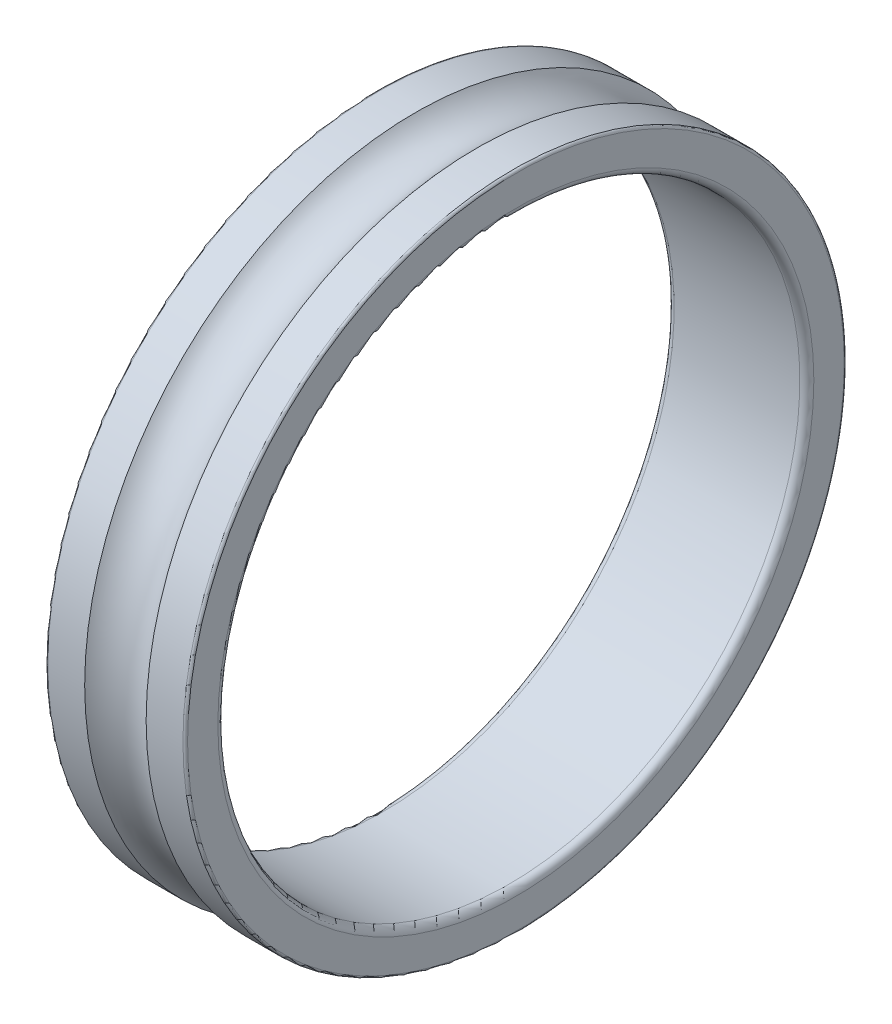
ISO-10303-21;
HEADER;
FILE_DESCRIPTION(('STEP AP214'),'2;1');
FILE_NAME('part.step','',(''),(''),'','','');
FILE_SCHEMA(('AUTOMOTIVE_DESIGN { 1 0 10303 214 1 1 1 1 }'));
ENDSEC;
DATA;
#1=APPLICATION_CONTEXT('core data for automotive mechanical design processes');
#2=APPLICATION_PROTOCOL_DEFINITION('international standard','automotive_design',2000,#1);
#3=PRODUCT_CONTEXT('',#1,'mechanical');
#4=PRODUCT('Part','Part','',(#3));
#5=PRODUCT_RELATED_PRODUCT_CATEGORY('part','',(#4));
#6=PRODUCT_DEFINITION_FORMATION('','',#4);
#7=PRODUCT_DEFINITION_CONTEXT('part definition',#1,'design');
#8=PRODUCT_DEFINITION('design','',#6,#7);
#9=PRODUCT_DEFINITION_SHAPE('','',#8);
#10=(LENGTH_UNIT() NAMED_UNIT(*) SI_UNIT(.MILLI.,.METRE.));
#11=(NAMED_UNIT(*) PLANE_ANGLE_UNIT() SI_UNIT($,.RADIAN.));
#12=(NAMED_UNIT(*) SI_UNIT($,.STERADIAN.) SOLID_ANGLE_UNIT());
#13=UNCERTAINTY_MEASURE_WITH_UNIT(LENGTH_MEASURE(1.E-05),#10,'distance_accuracy_value','');
#14=(GEOMETRIC_REPRESENTATION_CONTEXT(3) GLOBAL_UNCERTAINTY_ASSIGNED_CONTEXT((#13)) GLOBAL_UNIT_ASSIGNED_CONTEXT((#10,
#11,#12)) REPRESENTATION_CONTEXT('',''));
#15=CARTESIAN_POINT('',(0.,0.,0.));
#16=DIRECTION('',(0.,0.,1.));
#17=DIRECTION('',(1.,0.,0.));
#18=AXIS2_PLACEMENT_3D('',#15,#16,#17);
#19=CARTESIAN_POINT('',(0.,-28.72385287695,-28.2));
#20=DIRECTION('',(-1.,0.,0.));
#21=DIRECTION('',(0.,0.,1.));
#22=AXIS2_PLACEMENT_3D('',#19,#20,#21);
#23=PLANE('',#22);
#24=CARTESIAN_POINT('',(0.,0.,0.));
#25=DIRECTION('',(-1.,0.,0.));
#26=DIRECTION('',(0.,0.,-1.));
#27=AXIS2_PLACEMENT_3D('',#24,#25,#26);
#28=CIRCLE('',#27,28.1999999999995);
#29=CARTESIAN_POINT('',(0.,0.,-28.1999999999995));
#30=VERTEX_POINT('',#29);
#31=EDGE_CURVE('E50',#30,#30,#28,.F.);
#32=ORIENTED_EDGE('',*,*,#31,.F.);
#33=EDGE_LOOP('',(#32));
#34=FACE_BOUND('',#33,.T.);
#35=CARTESIAN_POINT('',(0.,0.,0.));
#36=DIRECTION('',(1.,0.,0.));
#37=DIRECTION('',(0.,0.,1.));
#38=AXIS2_PLACEMENT_3D('',#35,#36,#37);
#39=CIRCLE('',#38,25.6);
#40=CARTESIAN_POINT('',(0.,0.,25.6));
#41=VERTEX_POINT('',#40);
#42=EDGE_CURVE('E47',#41,#41,#39,.T.);
#43=ORIENTED_EDGE('',*,*,#42,.T.);
#44=EDGE_LOOP('',(#43));
#45=FACE_BOUND('',#44,.T.);
#46=ADVANCED_FACE('F15',(#34,#45),#23,.T.);
#47=CARTESIAN_POINT('',(12.,-28.7238528444883,28.2));
#48=DIRECTION('',(1.,0.,0.));
#49=DIRECTION('',(0.,0.,-1.));
#50=AXIS2_PLACEMENT_3D('',#47,#48,#49);
#51=PLANE('',#50);
#52=CARTESIAN_POINT('',(12.,0.,0.));
#53=DIRECTION('',(1.,0.,0.));
#54=DIRECTION('',(0.,-1.16841672664942E-09,1.));
#55=AXIS2_PLACEMENT_3D('',#52,#53,#54);
#56=CIRCLE('',#55,28.2);
#57=CARTESIAN_POINT('',(12.,-3.29493516915136E-08,28.2));
#58=VERTEX_POINT('',#57);
#59=EDGE_CURVE('E44',#58,#58,#56,.T.);
#60=ORIENTED_EDGE('',*,*,#59,.T.);
#61=EDGE_LOOP('',(#60));
#62=FACE_BOUND('',#61,.T.);
#63=CARTESIAN_POINT('',(12.,0.,0.));
#64=DIRECTION('',(-1.,0.,0.));
#65=DIRECTION('',(0.,0.,-1.));
#66=AXIS2_PLACEMENT_3D('',#63,#64,#65);
#67=CIRCLE('',#66,25.6);
#68=CARTESIAN_POINT('',(12.,0.,-25.6));
#69=VERTEX_POINT('',#68);
#70=EDGE_CURVE('E41',#69,#69,#67,.F.);
#71=ORIENTED_EDGE('',*,*,#70,.F.);
#72=EDGE_LOOP('',(#71));
#73=FACE_BOUND('',#72,.T.);
#74=ADVANCED_FACE('F58',(#62,#73),#51,.T.);
#75=CARTESIAN_POINT('',(0.599999999999872,0.,0.));
#76=DIRECTION('',(1.,0.,0.));
#77=DIRECTION('',(0.,0.,1.));
#78=AXIS2_PLACEMENT_3D('',#75,#76,#77);
#79=TOROIDAL_SURFACE('',#78,25.6,0.599999999999872);
#80=CARTESIAN_POINT('',(0.6,0.,0.));
#81=DIRECTION('',(1.,0.,0.));
#82=DIRECTION('',(0.,0.,1.));
#83=AXIS2_PLACEMENT_3D('',#80,#81,#82);
#84=CIRCLE('',#83,25.0000000000001);
#85=CARTESIAN_POINT('',(0.6,0.,25.0000000000001));
#86=VERTEX_POINT('',#85);
#87=EDGE_CURVE('E38',#86,#86,#84,.T.);
#88=ORIENTED_EDGE('',*,*,#87,.T.);
#89=EDGE_LOOP('',(#88));
#90=FACE_BOUND('',#89,.T.);
#91=ORIENTED_EDGE('',*,*,#42,.F.);
#92=EDGE_LOOP('',(#91));
#93=FACE_BOUND('',#92,.T.);
#94=ADVANCED_FACE('F62',(#90,#93),#79,.T.);
#95=CARTESIAN_POINT('',(100.,0.,0.));
#96=DIRECTION('',(1.,0.,0.));
#97=DIRECTION('',(0.,0.,1.));
#98=AXIS2_PLACEMENT_3D('',#95,#96,#97);
#99=CYLINDRICAL_SURFACE('',#98,25.);
#100=CARTESIAN_POINT('',(11.4,0.,0.));
#101=DIRECTION('',(1.,0.,0.));
#102=DIRECTION('',(0.,0.,1.));
#103=AXIS2_PLACEMENT_3D('',#100,#101,#102);
#104=CIRCLE('',#103,25.);
#105=CARTESIAN_POINT('',(11.4,0.,25.));
#106=VERTEX_POINT('',#105);
#107=EDGE_CURVE('E35',#106,#106,#104,.T.);
#108=ORIENTED_EDGE('',*,*,#107,.T.);
#109=EDGE_LOOP('',(#108));
#110=FACE_BOUND('',#109,.T.);
#111=ORIENTED_EDGE('',*,*,#87,.F.);
#112=EDGE_LOOP('',(#111));
#113=FACE_BOUND('',#112,.T.);
#114=ADVANCED_FACE('F64',(#110,#113),#99,.F.);
#115=CARTESIAN_POINT('',(11.4000000000002,0.,0.));
#116=DIRECTION('',(1.,0.,0.));
#117=DIRECTION('',(0.,0.,1.));
#118=AXIS2_PLACEMENT_3D('',#115,#116,#117);
#119=TOROIDAL_SURFACE('',#118,25.6,0.599999999999747);
#120=ORIENTED_EDGE('',*,*,#70,.T.);
#121=EDGE_LOOP('',(#120));
#122=FACE_BOUND('',#121,.T.);
#123=ORIENTED_EDGE('',*,*,#107,.F.);
#124=EDGE_LOOP('',(#123));
#125=FACE_BOUND('',#124,.T.);
#126=ADVANCED_FACE('F72',(#122,#125),#119,.T.);
#127=CARTESIAN_POINT('',(11.7999999999989,0.,0.));
#128=DIRECTION('',(1.,0.,0.));
#129=DIRECTION('',(0.,0.,1.));
#130=AXIS2_PLACEMENT_3D('',#127,#128,#129);
#131=TOROIDAL_SURFACE('',#130,28.199999999999,0.200000000001052);
#132=CARTESIAN_POINT('',(11.7999999999989,0.,0.));
#133=DIRECTION('',(1.,0.,0.));
#134=DIRECTION('',(0.,0.,1.));
#135=AXIS2_PLACEMENT_3D('',#132,#133,#134);
#136=CIRCLE('',#135,28.4);
#137=CARTESIAN_POINT('',(11.7999999999989,0.,28.4));
#138=VERTEX_POINT('',#137);
#139=EDGE_CURVE('E30',#138,#138,#136,.T.);
#140=ORIENTED_EDGE('',*,*,#139,.T.);
#141=EDGE_LOOP('',(#140));
#142=FACE_BOUND('',#141,.T.);
#143=ORIENTED_EDGE('',*,*,#59,.F.);
#144=EDGE_LOOP('',(#143));
#145=FACE_BOUND('',#144,.T.);
#146=ADVANCED_FACE('F80',(#142,#145),#131,.T.);
#147=CARTESIAN_POINT('',(100.,0.,0.));
#148=DIRECTION('',(1.,0.,0.));
#149=DIRECTION('',(0.,0.,1.));
#150=AXIS2_PLACEMENT_3D('',#147,#148,#149);
#151=CYLINDRICAL_SURFACE('',#150,28.4);
#152=CARTESIAN_POINT('',(8.6401708751518,0.,0.));
#153=DIRECTION('',(1.,0.,0.));
#154=DIRECTION('',(0.,0.,1.));
#155=AXIS2_PLACEMENT_3D('',#152,#153,#154);
#156=CIRCLE('',#155,28.4);
#157=CARTESIAN_POINT('',(8.6401708751518,0.,28.4));
#158=VERTEX_POINT('',#157);
#159=EDGE_CURVE('E26',#158,#158,#156,.T.);
#160=ORIENTED_EDGE('',*,*,#159,.T.);
#161=EDGE_LOOP('',(#160));
#162=FACE_BOUND('',#161,.T.);
#163=ORIENTED_EDGE('',*,*,#139,.F.);
#164=EDGE_LOOP('',(#163));
#165=FACE_BOUND('',#164,.T.);
#166=ADVANCED_FACE('F84',(#162,#165),#151,.T.);
#167=CARTESIAN_POINT('',(6.,0.,0.));
#168=DIRECTION('',(1.,0.,0.));
#169=DIRECTION('',(0.,0.,1.));
#170=AXIS2_PLACEMENT_3D('',#167,#168,#169);
#171=TOROIDAL_SURFACE('',#170,30.5,3.37349999999994);
#172=ORIENTED_EDGE('',*,*,#159,.F.);
#173=EDGE_LOOP('',(#172));
#174=FACE_BOUND('',#173,.T.);
#175=CARTESIAN_POINT('',(3.35982912484823,0.,0.));
#176=DIRECTION('',(1.,0.,0.));
#177=DIRECTION('',(0.,0.,1.));
#178=AXIS2_PLACEMENT_3D('',#175,#176,#177);
#179=CIRCLE('',#178,28.4);
#180=CARTESIAN_POINT('',(3.35982912484823,0.,28.4));
#181=VERTEX_POINT('',#180);
#182=EDGE_CURVE('E22',#181,#181,#179,.T.);
#183=ORIENTED_EDGE('',*,*,#182,.T.);
#184=EDGE_LOOP('',(#183));
#185=FACE_BOUND('',#184,.T.);
#186=ADVANCED_FACE('F88',(#174,#185),#171,.F.);
#187=CARTESIAN_POINT('',(100.,0.,0.));
#188=DIRECTION('',(1.,0.,0.));
#189=DIRECTION('',(0.,0.,1.));
#190=AXIS2_PLACEMENT_3D('',#187,#188,#189);
#191=CYLINDRICAL_SURFACE('',#190,28.4);
#192=CARTESIAN_POINT('',(0.200000000000003,0.,0.));
#193=DIRECTION('',(1.,0.,0.));
#194=DIRECTION('',(0.,0.,1.));
#195=AXIS2_PLACEMENT_3D('',#192,#193,#194);
#196=CIRCLE('',#195,28.4);
#197=CARTESIAN_POINT('',(0.200000000000003,0.,28.4));
#198=VERTEX_POINT('',#197);
#199=EDGE_CURVE('E10',#198,#198,#196,.T.);
#200=ORIENTED_EDGE('',*,*,#199,.T.);
#201=EDGE_LOOP('',(#200));
#202=FACE_BOUND('',#201,.T.);
#203=ORIENTED_EDGE('',*,*,#182,.F.);
#204=EDGE_LOOP('',(#203));
#205=FACE_BOUND('',#204,.T.);
#206=ADVANCED_FACE('F91',(#202,#205),#191,.T.);
#207=CARTESIAN_POINT('',(0.200000000000526,0.,0.));
#208=DIRECTION('',(1.,0.,0.));
#209=DIRECTION('',(0.,1.16841659714859E-09,1.));
#210=AXIS2_PLACEMENT_3D('',#207,#208,#209);
#211=TOROIDAL_SURFACE('',#210,28.1999999999995,0.200000000000526);
#212=ORIENTED_EDGE('',*,*,#31,.T.);
#213=EDGE_LOOP('',(#212));
#214=FACE_BOUND('',#213,.T.);
#215=ORIENTED_EDGE('',*,*,#199,.F.);
#216=EDGE_LOOP('',(#215));
#217=FACE_BOUND('',#216,.T.);
#218=ADVANCED_FACE('F17',(#214,#217),#211,.T.);
#219=CLOSED_SHELL('',(#46,#74,#94,#114,#126,#146,#166,#186,#206,#218));
#220=MANIFOLD_SOLID_BREP('B1',#219);
#221=ADVANCED_BREP_SHAPE_REPRESENTATION('',(#18,#220),#14);
#222=SHAPE_DEFINITION_REPRESENTATION(#9,#221);
ENDSEC;
END-ISO-10303-21;
